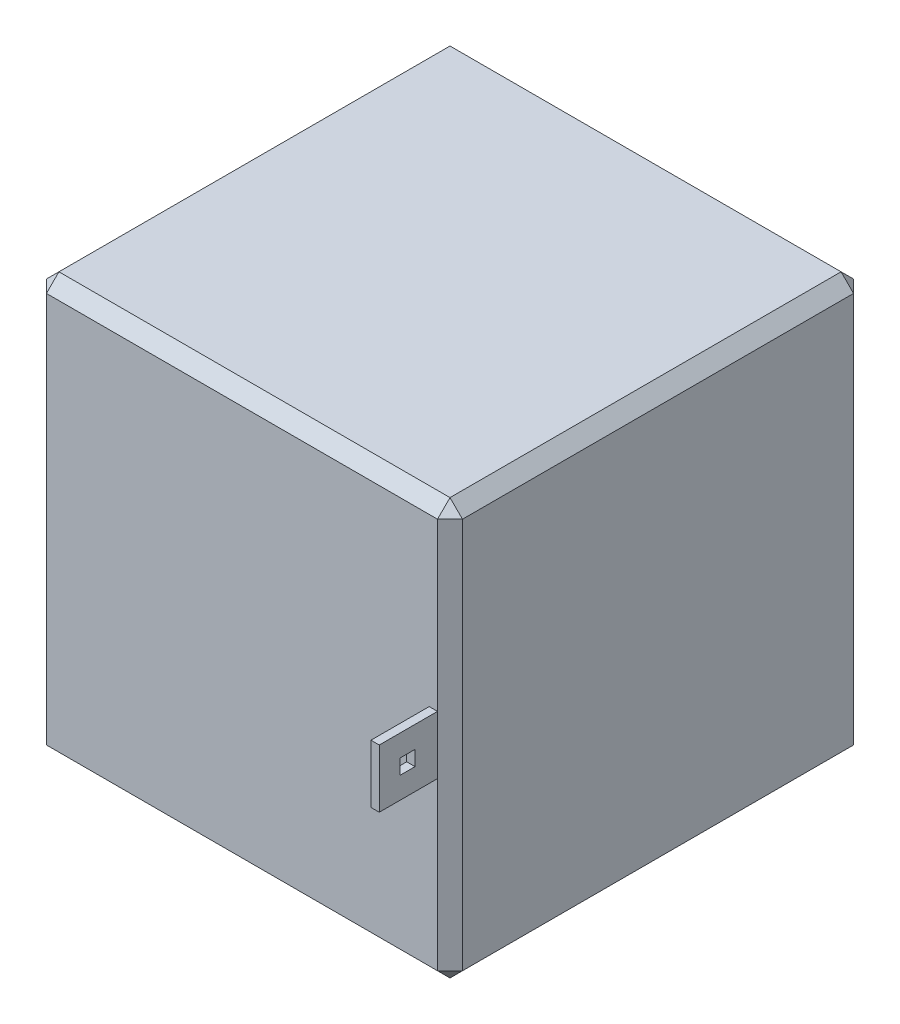
ISO-10303-21;
HEADER;
FILE_DESCRIPTION(('STEP AP214'),'2;1');
FILE_NAME('part.step','',(''),(''),'','','');
FILE_SCHEMA(('AUTOMOTIVE_DESIGN { 1 0 10303 214 1 1 1 1 }'));
ENDSEC;
DATA;
#1=APPLICATION_CONTEXT('core data for automotive mechanical design processes');
#2=APPLICATION_PROTOCOL_DEFINITION('international standard','automotive_design',2000,#1);
#3=PRODUCT_CONTEXT('',#1,'mechanical');
#4=PRODUCT('Part','Part','',(#3));
#5=PRODUCT_RELATED_PRODUCT_CATEGORY('part','',(#4));
#6=PRODUCT_DEFINITION_FORMATION('','',#4);
#7=PRODUCT_DEFINITION_CONTEXT('part definition',#1,'design');
#8=PRODUCT_DEFINITION('design','',#6,#7);
#9=PRODUCT_DEFINITION_SHAPE('','',#8);
#10=(LENGTH_UNIT() NAMED_UNIT(*) SI_UNIT(.MILLI.,.METRE.));
#11=(NAMED_UNIT(*) PLANE_ANGLE_UNIT() SI_UNIT($,.RADIAN.));
#12=(NAMED_UNIT(*) SI_UNIT($,.STERADIAN.) SOLID_ANGLE_UNIT());
#13=UNCERTAINTY_MEASURE_WITH_UNIT(LENGTH_MEASURE(1.E-05),#10,'distance_accuracy_value','');
#14=(GEOMETRIC_REPRESENTATION_CONTEXT(3) GLOBAL_UNCERTAINTY_ASSIGNED_CONTEXT((#13)) GLOBAL_UNIT_ASSIGNED_CONTEXT((#10,
#11,#12)) REPRESENTATION_CONTEXT('',''));
#15=CARTESIAN_POINT('',(0.,0.,0.));
#16=DIRECTION('',(0.,0.,1.));
#17=DIRECTION('',(1.,0.,0.));
#18=AXIS2_PLACEMENT_3D('',#15,#16,#17);
#19=CARTESIAN_POINT('',(0.,0.,50.));
#20=DIRECTION('',(0.,0.,-1.));
#21=DIRECTION('',(-1.,0.,0.));
#22=AXIS2_PLACEMENT_3D('',#19,#20,#21);
#23=PLANE('',#22);
#24=DIRECTION('',(1.,0.,0.));
#25=VECTOR('',#24,1.);
#26=CARTESIAN_POINT('',(48.5,21.5,50.));
#27=LINE('',#26,#25);
#28=CARTESIAN_POINT('',(47.5,21.5,50.));
#29=VERTEX_POINT('',#28);
#30=CARTESIAN_POINT('',(48.5,21.5,50.));
#31=VERTEX_POINT('',#30);
#32=EDGE_CURVE('E210',#29,#31,#27,.T.);
#33=ORIENTED_EDGE('',*,*,#32,.F.);
#34=DIRECTION('',(0.,-1.,0.));
#35=VECTOR('',#34,1.);
#36=CARTESIAN_POINT('',(47.5,21.5,50.));
#37=LINE('',#36,#35);
#38=CARTESIAN_POINT('',(47.5,28.5,50.));
#39=VERTEX_POINT('',#38);
#40=EDGE_CURVE('E217',#39,#29,#37,.T.);
#41=ORIENTED_EDGE('',*,*,#40,.F.);
#42=DIRECTION('',(-1.,0.,0.));
#43=VECTOR('',#42,1.);
#44=CARTESIAN_POINT('',(48.5,28.5,50.));
#45=LINE('',#44,#43);
#46=CARTESIAN_POINT('',(48.5,28.5,50.));
#47=VERTEX_POINT('',#46);
#48=EDGE_CURVE('E220',#47,#39,#45,.T.);
#49=ORIENTED_EDGE('',*,*,#48,.F.);
#50=DIRECTION('',(0.,1.,0.));
#51=VECTOR('',#50,1.);
#52=CARTESIAN_POINT('',(48.5,0.,50.));
#53=LINE('',#52,#51);
#54=CARTESIAN_POINT('',(48.5,48.5,50.));
#55=VERTEX_POINT('',#54);
#56=EDGE_CURVE('E386',#47,#55,#53,.T.);
#57=ORIENTED_EDGE('',*,*,#56,.T.);
#58=DIRECTION('',(-1.,0.,0.));
#59=VECTOR('',#58,1.);
#60=CARTESIAN_POINT('',(0.,48.5,50.));
#61=LINE('',#60,#59);
#62=CARTESIAN_POINT('',(1.50000000000002,48.5,50.));
#63=VERTEX_POINT('',#62);
#64=EDGE_CURVE('E237',#55,#63,#61,.T.);
#65=ORIENTED_EDGE('',*,*,#64,.T.);
#66=DIRECTION('',(0.,-1.,0.));
#67=VECTOR('',#66,1.);
#68=CARTESIAN_POINT('',(1.50000000000002,0.,50.));
#69=LINE('',#68,#67);
#70=CARTESIAN_POINT('',(1.50000000000002,1.50000000000002,50.));
#71=VERTEX_POINT('',#70);
#72=EDGE_CURVE('E526',#63,#71,#69,.T.);
#73=ORIENTED_EDGE('',*,*,#72,.T.);
#74=DIRECTION('',(1.,0.,0.));
#75=VECTOR('',#74,1.);
#76=CARTESIAN_POINT('',(0.,1.50000000000002,50.));
#77=LINE('',#76,#75);
#78=CARTESIAN_POINT('',(48.5,1.50000000000002,50.));
#79=VERTEX_POINT('',#78);
#80=EDGE_CURVE('E453',#71,#79,#77,.T.);
#81=ORIENTED_EDGE('',*,*,#80,.T.);
#82=EDGE_CURVE('E383',#79,#31,#53,.T.);
#83=ORIENTED_EDGE('',*,*,#82,.T.);
#84=EDGE_LOOP('',(#33,#41,#49,#57,#65,#73,#81,#83));
#85=FACE_BOUND('',#84,.T.);
#86=ADVANCED_FACE('F39',(#85),#23,.F.);
#87=CARTESIAN_POINT('',(0.,0.,50.));
#88=DIRECTION('',(1.,0.,0.));
#89=DIRECTION('',(0.,0.,-1.));
#90=AXIS2_PLACEMENT_3D('',#87,#88,#89);
#91=PLANE('',#90);
#92=DIRECTION('',(0.,0.,-1.));
#93=VECTOR('',#92,1.);
#94=CARTESIAN_POINT('',(0.,48.5,50.));
#95=LINE('',#94,#93);
#96=CARTESIAN_POINT('',(0.,48.5,48.5));
#97=VERTEX_POINT('',#96);
#98=CARTESIAN_POINT('',(0.,48.5,1.50000000000002));
#99=VERTEX_POINT('',#98);
#100=EDGE_CURVE('E485',#97,#99,#95,.T.);
#101=ORIENTED_EDGE('',*,*,#100,.T.);
#102=DIRECTION('',(0.,-1.,0.));
#103=VECTOR('',#102,1.);
#104=CARTESIAN_POINT('',(0.,0.,1.50000000000002));
#105=LINE('',#104,#103);
#106=CARTESIAN_POINT('',(0.,1.50000000000002,1.50000000000002));
#107=VERTEX_POINT('',#106);
#108=EDGE_CURVE('E487',#99,#107,#105,.T.);
#109=ORIENTED_EDGE('',*,*,#108,.T.);
#110=DIRECTION('',(0.,0.,1.));
#111=VECTOR('',#110,1.);
#112=CARTESIAN_POINT('',(0.,1.50000000000002,50.));
#113=LINE('',#112,#111);
#114=CARTESIAN_POINT('',(0.,1.50000000000002,48.5));
#115=VERTEX_POINT('',#114);
#116=EDGE_CURVE('E483',#107,#115,#113,.T.);
#117=ORIENTED_EDGE('',*,*,#116,.T.);
#118=DIRECTION('',(0.,1.,0.));
#119=VECTOR('',#118,1.);
#120=CARTESIAN_POINT('',(0.,0.,48.5));
#121=LINE('',#120,#119);
#122=EDGE_CURVE('E449',#115,#97,#121,.T.);
#123=ORIENTED_EDGE('',*,*,#122,.T.);
#124=EDGE_LOOP('',(#101,#109,#117,#123));
#125=FACE_BOUND('',#124,.T.);
#126=ADVANCED_FACE('F259',(#125),#91,.F.);
#127=CARTESIAN_POINT('',(0.,0.,50.));
#128=DIRECTION('',(0.,1.,0.));
#129=DIRECTION('',(0.,0.,1.));
#130=AXIS2_PLACEMENT_3D('',#127,#128,#129);
#131=PLANE('',#130);
#132=DIRECTION('',(-1.,0.,0.));
#133=VECTOR('',#132,1.);
#134=CARTESIAN_POINT('',(0.,0.,48.5));
#135=LINE('',#134,#133);
#136=CARTESIAN_POINT('',(48.5,0.,48.5));
#137=VERTEX_POINT('',#136);
#138=CARTESIAN_POINT('',(1.50000000000002,0.,48.5));
#139=VERTEX_POINT('',#138);
#140=EDGE_CURVE('E517',#137,#139,#135,.T.);
#141=ORIENTED_EDGE('',*,*,#140,.T.);
#142=DIRECTION('',(0.,0.,-1.));
#143=VECTOR('',#142,1.);
#144=CARTESIAN_POINT('',(1.50000000000002,0.,50.));
#145=LINE('',#144,#143);
#146=CARTESIAN_POINT('',(1.50000000000002,0.,1.50000000000002));
#147=VERTEX_POINT('',#146);
#148=EDGE_CURVE('E523',#139,#147,#145,.T.);
#149=ORIENTED_EDGE('',*,*,#148,.T.);
#150=DIRECTION('',(1.,0.,0.));
#151=VECTOR('',#150,1.);
#152=CARTESIAN_POINT('',(50.,0.,1.50000000000002));
#153=LINE('',#152,#151);
#154=CARTESIAN_POINT('',(48.5,0.,1.50000000000002));
#155=VERTEX_POINT('',#154);
#156=EDGE_CURVE('E521',#147,#155,#153,.T.);
#157=ORIENTED_EDGE('',*,*,#156,.T.);
#158=DIRECTION('',(0.,0.,1.));
#159=VECTOR('',#158,1.);
#160=CARTESIAN_POINT('',(48.5,0.,50.));
#161=LINE('',#160,#159);
#162=EDGE_CURVE('E519',#155,#137,#161,.T.);
#163=ORIENTED_EDGE('',*,*,#162,.T.);
#164=EDGE_LOOP('',(#141,#149,#157,#163));
#165=FACE_BOUND('',#164,.T.);
#166=ADVANCED_FACE('F265',(#165),#131,.F.);
#167=CARTESIAN_POINT('',(50.,0.,50.));
#168=DIRECTION('',(-1.,0.,0.));
#169=DIRECTION('',(0.,0.,1.));
#170=AXIS2_PLACEMENT_3D('',#167,#168,#169);
#171=PLANE('',#170);
#172=DIRECTION('',(0.,1.,0.));
#173=VECTOR('',#172,1.);
#174=CARTESIAN_POINT('',(50.,50.,1.50000000000002));
#175=LINE('',#174,#173);
#176=CARTESIAN_POINT('',(50.,1.50000000000002,1.50000000000002));
#177=VERTEX_POINT('',#176);
#178=CARTESIAN_POINT('',(50.,48.5,1.50000000000002));
#179=VERTEX_POINT('',#178);
#180=EDGE_CURVE('E512',#177,#179,#175,.T.);
#181=ORIENTED_EDGE('',*,*,#180,.T.);
#182=DIRECTION('',(0.,0.,1.));
#183=VECTOR('',#182,1.);
#184=CARTESIAN_POINT('',(50.,48.5,50.));
#185=LINE('',#184,#183);
#186=CARTESIAN_POINT('',(50.,48.5,48.5));
#187=VERTEX_POINT('',#186);
#188=EDGE_CURVE('E514',#179,#187,#185,.T.);
#189=ORIENTED_EDGE('',*,*,#188,.T.);
#190=DIRECTION('',(0.,-1.,0.));
#191=VECTOR('',#190,1.);
#192=CARTESIAN_POINT('',(50.,0.,48.5));
#193=LINE('',#192,#191);
#194=CARTESIAN_POINT('',(50.,1.50000000000002,48.5));
#195=VERTEX_POINT('',#194);
#196=EDGE_CURVE('E508',#187,#195,#193,.T.);
#197=ORIENTED_EDGE('',*,*,#196,.T.);
#198=DIRECTION('',(0.,0.,-1.));
#199=VECTOR('',#198,1.);
#200=CARTESIAN_POINT('',(50.,1.50000000000002,50.));
#201=LINE('',#200,#199);
#202=EDGE_CURVE('E510',#195,#177,#201,.T.);
#203=ORIENTED_EDGE('',*,*,#202,.T.);
#204=EDGE_LOOP('',(#181,#189,#197,#203));
#205=FACE_BOUND('',#204,.T.);
#206=ADVANCED_FACE('F278',(#205),#171,.F.);
#207=CARTESIAN_POINT('',(0.,50.,50.));
#208=DIRECTION('',(0.,-1.,0.));
#209=DIRECTION('',(0.,0.,-1.));
#210=AXIS2_PLACEMENT_3D('',#207,#208,#209);
#211=PLANE('',#210);
#212=DIRECTION('',(-1.,0.,0.));
#213=VECTOR('',#212,1.);
#214=CARTESIAN_POINT('',(0.,50.,1.50000000000002));
#215=LINE('',#214,#213);
#216=CARTESIAN_POINT('',(48.5,50.,1.50000000000002));
#217=VERTEX_POINT('',#216);
#218=CARTESIAN_POINT('',(1.50000000000002,50.,1.50000000000002));
#219=VERTEX_POINT('',#218);
#220=EDGE_CURVE('E503',#217,#219,#215,.T.);
#221=ORIENTED_EDGE('',*,*,#220,.T.);
#222=DIRECTION('',(0.,0.,1.));
#223=VECTOR('',#222,1.);
#224=CARTESIAN_POINT('',(1.50000000000002,50.,50.));
#225=LINE('',#224,#223);
#226=CARTESIAN_POINT('',(1.50000000000002,50.,48.5));
#227=VERTEX_POINT('',#226);
#228=EDGE_CURVE('E505',#219,#227,#225,.T.);
#229=ORIENTED_EDGE('',*,*,#228,.T.);
#230=DIRECTION('',(1.,0.,0.));
#231=VECTOR('',#230,1.);
#232=CARTESIAN_POINT('',(0.,50.,48.5));
#233=LINE('',#232,#231);
#234=CARTESIAN_POINT('',(48.5,50.,48.5));
#235=VERTEX_POINT('',#234);
#236=EDGE_CURVE('E499',#227,#235,#233,.T.);
#237=ORIENTED_EDGE('',*,*,#236,.T.);
#238=DIRECTION('',(0.,0.,-1.));
#239=VECTOR('',#238,1.);
#240=CARTESIAN_POINT('',(48.5,50.,50.));
#241=LINE('',#240,#239);
#242=EDGE_CURVE('E501',#235,#217,#241,.T.);
#243=ORIENTED_EDGE('',*,*,#242,.T.);
#244=EDGE_LOOP('',(#221,#229,#237,#243));
#245=FACE_BOUND('',#244,.T.);
#246=ADVANCED_FACE('F274',(#245),#211,.F.);
#247=CARTESIAN_POINT('',(0.,0.,0.));
#248=DIRECTION('',(0.,0.,-1.));
#249=DIRECTION('',(-1.,0.,0.));
#250=AXIS2_PLACEMENT_3D('',#247,#248,#249);
#251=PLANE('',#250);
#252=DIRECTION('',(-1.,0.,0.));
#253=VECTOR('',#252,1.);
#254=CARTESIAN_POINT('',(0.,1.50000000000002,0.));
#255=LINE('',#254,#253);
#256=CARTESIAN_POINT('',(48.5,1.50000000000002,0.));
#257=VERTEX_POINT('',#256);
#258=CARTESIAN_POINT('',(1.50000000000002,1.50000000000002,0.));
#259=VERTEX_POINT('',#258);
#260=EDGE_CURVE('E490',#257,#259,#255,.T.);
#261=ORIENTED_EDGE('',*,*,#260,.T.);
#262=DIRECTION('',(0.,1.,0.));
#263=VECTOR('',#262,1.);
#264=CARTESIAN_POINT('',(1.50000000000002,50.,0.));
#265=LINE('',#264,#263);
#266=CARTESIAN_POINT('',(1.50000000000002,48.5,0.));
#267=VERTEX_POINT('',#266);
#268=EDGE_CURVE('E496',#259,#267,#265,.T.);
#269=ORIENTED_EDGE('',*,*,#268,.T.);
#270=DIRECTION('',(1.,0.,0.));
#271=VECTOR('',#270,1.);
#272=CARTESIAN_POINT('',(50.,48.5,0.));
#273=LINE('',#272,#271);
#274=CARTESIAN_POINT('',(48.5,48.5,0.));
#275=VERTEX_POINT('',#274);
#276=EDGE_CURVE('E494',#267,#275,#273,.T.);
#277=ORIENTED_EDGE('',*,*,#276,.T.);
#278=DIRECTION('',(0.,-1.,0.));
#279=VECTOR('',#278,1.);
#280=CARTESIAN_POINT('',(48.5,0.,0.));
#281=LINE('',#280,#279);
#282=EDGE_CURVE('E492',#275,#257,#281,.T.);
#283=ORIENTED_EDGE('',*,*,#282,.T.);
#284=EDGE_LOOP('',(#261,#269,#277,#283));
#285=FACE_BOUND('',#284,.T.);
#286=ADVANCED_FACE('F271',(#285),#251,.T.);
#287=CARTESIAN_POINT('',(48.5,0.,50.));
#288=DIRECTION('',(-0.707106781186547,0.,-0.707106781186547));
#289=DIRECTION('',(0.,1.,0.));
#290=AXIS2_PLACEMENT_3D('',#287,#288,#289);
#291=PLANE('',#290);
#292=DIRECTION('',(-0.707106781186547,0.,0.707106781186547));
#293=VECTOR('',#292,1.);
#294=CARTESIAN_POINT('',(50.,48.5,48.5));
#295=LINE('',#294,#293);
#296=EDGE_CURVE('E371',#55,#187,#295,.F.);
#297=ORIENTED_EDGE('',*,*,#296,.F.);
#298=ORIENTED_EDGE('',*,*,#56,.F.);
#299=DIRECTION('',(0.,1.,0.));
#300=VECTOR('',#299,1.);
#301=CARTESIAN_POINT('',(48.5,21.5,50.));
#302=LINE('',#301,#300);
#303=EDGE_CURVE('E203',#31,#47,#302,.T.);
#304=ORIENTED_EDGE('',*,*,#303,.F.);
#305=ORIENTED_EDGE('',*,*,#82,.F.);
#306=DIRECTION('',(0.707106781186547,0.,-0.707106781186547));
#307=VECTOR('',#306,1.);
#308=CARTESIAN_POINT('',(49.25,1.50000000000002,49.25));
#309=LINE('',#308,#307);
#310=EDGE_CURVE('E446',#195,#79,#309,.F.);
#311=ORIENTED_EDGE('',*,*,#310,.F.);
#312=ORIENTED_EDGE('',*,*,#196,.F.);
#313=EDGE_LOOP('',(#297,#298,#304,#305,#311,#312));
#314=FACE_BOUND('',#313,.T.);
#315=ADVANCED_FACE('F41',(#314),#291,.F.);
#316=CARTESIAN_POINT('',(50.,48.5,48.5));
#317=DIRECTION('',(0.577350269189626,0.577350269189626,0.577350269189626));
#318=DIRECTION('',(0.707106781186547,0.,-0.707106781186547));
#319=AXIS2_PLACEMENT_3D('',#316,#317,#318);
#320=PLANE('',#319);
#321=DIRECTION('',(0.,0.707106781186547,-0.707106781186547));
#322=VECTOR('',#321,1.);
#323=CARTESIAN_POINT('',(48.5,49.25,49.25));
#324=LINE('',#323,#322);
#325=EDGE_CURVE('E368',#55,#235,#324,.T.);
#326=ORIENTED_EDGE('',*,*,#325,.F.);
#327=ORIENTED_EDGE('',*,*,#296,.T.);
#328=DIRECTION('',(0.707106781186547,-0.707106781186547,0.));
#329=VECTOR('',#328,1.);
#330=CARTESIAN_POINT('',(50.,48.5,48.5));
#331=LINE('',#330,#329);
#332=EDGE_CURVE('E373',#235,#187,#331,.T.);
#333=ORIENTED_EDGE('',*,*,#332,.F.);
#334=EDGE_LOOP('',(#326,#327,#333));
#335=FACE_BOUND('',#334,.T.);
#336=ADVANCED_FACE('F356',(#335),#320,.T.);
#337=CARTESIAN_POINT('',(48.5,0.,48.5));
#338=DIRECTION('',(0.577350269189626,-0.577350269189626,0.577350269189626));
#339=DIRECTION('',(0.707106781186547,0.,-0.707106781186547));
#340=AXIS2_PLACEMENT_3D('',#337,#338,#339);
#341=PLANE('',#340);
#342=DIRECTION('',(-0.707106781186547,-0.707106781186547,0.));
#343=VECTOR('',#342,1.);
#344=CARTESIAN_POINT('',(48.5,0.,48.5));
#345=LINE('',#344,#343);
#346=EDGE_CURVE('E440',#195,#137,#345,.T.);
#347=ORIENTED_EDGE('',*,*,#346,.F.);
#348=ORIENTED_EDGE('',*,*,#310,.T.);
#349=DIRECTION('',(0.,0.707106781186547,0.707106781186547));
#350=VECTOR('',#349,1.);
#351=CARTESIAN_POINT('',(48.5,0.,48.5));
#352=LINE('',#351,#350);
#353=EDGE_CURVE('E376',#137,#79,#352,.T.);
#354=ORIENTED_EDGE('',*,*,#353,.F.);
#355=EDGE_LOOP('',(#347,#348,#354));
#356=FACE_BOUND('',#355,.T.);
#357=ADVANCED_FACE('F353',(#356),#341,.T.);
#358=CARTESIAN_POINT('',(48.5,50.,50.));
#359=DIRECTION('',(-0.707106781186547,-0.707106781186547,0.));
#360=DIRECTION('',(0.,0.,-1.));
#361=AXIS2_PLACEMENT_3D('',#358,#359,#360);
#362=PLANE('',#361);
#363=ORIENTED_EDGE('',*,*,#332,.T.);
#364=ORIENTED_EDGE('',*,*,#188,.F.);
#365=DIRECTION('',(-0.707106781186547,0.707106781186547,0.));
#366=VECTOR('',#365,1.);
#367=CARTESIAN_POINT('',(49.25,49.25,1.50000000000002));
#368=LINE('',#367,#366);
#369=EDGE_CURVE('E434',#217,#179,#368,.F.);
#370=ORIENTED_EDGE('',*,*,#369,.F.);
#371=ORIENTED_EDGE('',*,*,#242,.F.);
#372=EDGE_LOOP('',(#363,#364,#370,#371));
#373=FACE_BOUND('',#372,.T.);
#374=ADVANCED_FACE('F349',(#373),#362,.F.);
#375=CARTESIAN_POINT('',(0.,48.5,50.));
#376=DIRECTION('',(0.,-0.707106781186547,-0.707106781186547));
#377=DIRECTION('',(-1.,0.,0.));
#378=AXIS2_PLACEMENT_3D('',#375,#376,#377);
#379=PLANE('',#378);
#380=ORIENTED_EDGE('',*,*,#325,.T.);
#381=ORIENTED_EDGE('',*,*,#236,.F.);
#382=DIRECTION('',(0.,-0.707106781186547,0.707106781186547));
#383=VECTOR('',#382,1.);
#384=CARTESIAN_POINT('',(1.50000000000002,50.,48.5));
#385=LINE('',#384,#383);
#386=EDGE_CURVE('E381',#63,#227,#385,.F.);
#387=ORIENTED_EDGE('',*,*,#386,.F.);
#388=ORIENTED_EDGE('',*,*,#64,.F.);
#389=EDGE_LOOP('',(#380,#381,#387,#388));
#390=FACE_BOUND('',#389,.T.);
#391=ADVANCED_FACE('F345',(#390),#379,.F.);
#392=CARTESIAN_POINT('',(1.50000000000002,0.,50.));
#393=DIRECTION('',(0.707106781186547,0.,-0.707106781186547));
#394=DIRECTION('',(0.,-1.,0.));
#395=AXIS2_PLACEMENT_3D('',#392,#393,#394);
#396=PLANE('',#395);
#397=DIRECTION('',(0.707106781186547,0.,0.707106781186547));
#398=VECTOR('',#397,1.);
#399=CARTESIAN_POINT('',(0.,1.50000000000002,48.5));
#400=LINE('',#399,#398);
#401=EDGE_CURVE('E428',#71,#115,#400,.F.);
#402=ORIENTED_EDGE('',*,*,#401,.F.);
#403=ORIENTED_EDGE('',*,*,#72,.F.);
#404=DIRECTION('',(-0.707106781186547,0.,-0.707106781186547));
#405=VECTOR('',#404,1.);
#406=CARTESIAN_POINT('',(0.750000000000008,48.5,49.25));
#407=LINE('',#406,#405);
#408=EDGE_CURVE('E431',#97,#63,#407,.F.);
#409=ORIENTED_EDGE('',*,*,#408,.F.);
#410=ORIENTED_EDGE('',*,*,#122,.F.);
#411=EDGE_LOOP('',(#402,#403,#409,#410));
#412=FACE_BOUND('',#411,.T.);
#413=ADVANCED_FACE('F341',(#412),#396,.F.);
#414=CARTESIAN_POINT('',(0.,1.50000000000002,50.));
#415=DIRECTION('',(0.,0.707106781186547,-0.707106781186547));
#416=DIRECTION('',(1.,0.,0.));
#417=AXIS2_PLACEMENT_3D('',#414,#415,#416);
#418=PLANE('',#417);
#419=ORIENTED_EDGE('',*,*,#353,.T.);
#420=ORIENTED_EDGE('',*,*,#80,.F.);
#421=DIRECTION('',(0.,-0.707106781186547,-0.707106781186547));
#422=VECTOR('',#421,1.);
#423=CARTESIAN_POINT('',(1.50000000000002,0.750000000000008,49.25));
#424=LINE('',#423,#422);
#425=EDGE_CURVE('E425',#139,#71,#424,.F.);
#426=ORIENTED_EDGE('',*,*,#425,.F.);
#427=ORIENTED_EDGE('',*,*,#140,.F.);
#428=EDGE_LOOP('',(#419,#420,#426,#427));
#429=FACE_BOUND('',#428,.T.);
#430=ADVANCED_FACE('F337',(#429),#418,.F.);
#431=CARTESIAN_POINT('',(50.,1.50000000000002,50.));
#432=DIRECTION('',(-0.707106781186547,0.707106781186547,0.));
#433=DIRECTION('',(0.,0.,-1.));
#434=AXIS2_PLACEMENT_3D('',#431,#432,#433);
#435=PLANE('',#434);
#436=ORIENTED_EDGE('',*,*,#346,.T.);
#437=ORIENTED_EDGE('',*,*,#162,.F.);
#438=DIRECTION('',(0.707106781186547,0.707106781186547,0.));
#439=VECTOR('',#438,1.);
#440=CARTESIAN_POINT('',(49.25,0.750000000000008,1.50000000000002));
#441=LINE('',#440,#439);
#442=EDGE_CURVE('E422',#177,#155,#441,.F.);
#443=ORIENTED_EDGE('',*,*,#442,.F.);
#444=ORIENTED_EDGE('',*,*,#202,.F.);
#445=EDGE_LOOP('',(#436,#437,#443,#444));
#446=FACE_BOUND('',#445,.T.);
#447=ADVANCED_FACE('F333',(#446),#435,.F.);
#448=CARTESIAN_POINT('',(50.,0.,1.50000000000002));
#449=DIRECTION('',(0.707106781186547,0.,-0.707106781186547));
#450=DIRECTION('',(0.,-1.,0.));
#451=AXIS2_PLACEMENT_3D('',#448,#449,#450);
#452=PLANE('',#451);
#453=DIRECTION('',(-0.707106781186547,0.,-0.707106781186547));
#454=VECTOR('',#453,1.);
#455=CARTESIAN_POINT('',(48.5,48.5,0.));
#456=LINE('',#455,#454);
#457=EDGE_CURVE('E437',#179,#275,#456,.T.);
#458=ORIENTED_EDGE('',*,*,#457,.F.);
#459=ORIENTED_EDGE('',*,*,#180,.F.);
#460=DIRECTION('',(0.707106781186547,0.,0.707106781186547));
#461=VECTOR('',#460,1.);
#462=CARTESIAN_POINT('',(48.5,1.50000000000002,0.));
#463=LINE('',#462,#461);
#464=EDGE_CURVE('E419',#257,#177,#463,.T.);
#465=ORIENTED_EDGE('',*,*,#464,.F.);
#466=ORIENTED_EDGE('',*,*,#282,.F.);
#467=EDGE_LOOP('',(#458,#459,#465,#466));
#468=FACE_BOUND('',#467,.T.);
#469=ADVANCED_FACE('F329',(#468),#452,.T.);
#470=CARTESIAN_POINT('',(48.5,48.5,0.));
#471=DIRECTION('',(0.577350269189626,0.577350269189626,-0.577350269189626));
#472=DIRECTION('',(-0.707106781186547,0.,-0.707106781186547));
#473=AXIS2_PLACEMENT_3D('',#470,#471,#472);
#474=PLANE('',#473);
#475=ORIENTED_EDGE('',*,*,#369,.T.);
#476=ORIENTED_EDGE('',*,*,#457,.T.);
#477=DIRECTION('',(0.,0.707106781186547,0.707106781186547));
#478=VECTOR('',#477,1.);
#479=CARTESIAN_POINT('',(48.5,48.5,0.));
#480=LINE('',#479,#478);
#481=EDGE_CURVE('E416',#217,#275,#480,.F.);
#482=ORIENTED_EDGE('',*,*,#481,.F.);
#483=EDGE_LOOP('',(#475,#476,#482));
#484=FACE_BOUND('',#483,.T.);
#485=ADVANCED_FACE('F325',(#484),#474,.T.);
#486=CARTESIAN_POINT('',(1.50000000000002,50.,48.5));
#487=DIRECTION('',(-0.577350269189626,0.577350269189626,0.577350269189626));
#488=DIRECTION('',(0.707106781186547,0.,0.707106781186547));
#489=AXIS2_PLACEMENT_3D('',#486,#487,#488);
#490=PLANE('',#489);
#491=ORIENTED_EDGE('',*,*,#408,.T.);
#492=ORIENTED_EDGE('',*,*,#386,.T.);
#493=DIRECTION('',(0.707106781186547,0.707106781186547,0.));
#494=VECTOR('',#493,1.);
#495=CARTESIAN_POINT('',(1.50000000000002,50.,48.5));
#496=LINE('',#495,#494);
#497=EDGE_CURVE('E414',#97,#227,#496,.T.);
#498=ORIENTED_EDGE('',*,*,#497,.F.);
#499=EDGE_LOOP('',(#491,#492,#498));
#500=FACE_BOUND('',#499,.T.);
#501=ADVANCED_FACE('F321',(#500),#490,.T.);
#502=CARTESIAN_POINT('',(0.,1.50000000000002,48.5));
#503=DIRECTION('',(-0.577350269189626,-0.577350269189626,0.577350269189626));
#504=DIRECTION('',(0.707106781186547,0.,0.707106781186547));
#505=AXIS2_PLACEMENT_3D('',#502,#503,#504);
#506=PLANE('',#505);
#507=ORIENTED_EDGE('',*,*,#425,.T.);
#508=ORIENTED_EDGE('',*,*,#401,.T.);
#509=DIRECTION('',(-0.707106781186547,0.707106781186547,0.));
#510=VECTOR('',#509,1.);
#511=CARTESIAN_POINT('',(0.,1.50000000000002,48.5));
#512=LINE('',#511,#510);
#513=EDGE_CURVE('E411',#139,#115,#512,.T.);
#514=ORIENTED_EDGE('',*,*,#513,.F.);
#515=EDGE_LOOP('',(#507,#508,#514));
#516=FACE_BOUND('',#515,.T.);
#517=ADVANCED_FACE('F317',(#516),#506,.T.);
#518=CARTESIAN_POINT('',(48.5,1.50000000000002,0.));
#519=DIRECTION('',(0.577350269189626,-0.577350269189626,-0.577350269189626));
#520=DIRECTION('',(-0.707106781186547,0.,-0.707106781186547));
#521=AXIS2_PLACEMENT_3D('',#518,#519,#520);
#522=PLANE('',#521);
#523=ORIENTED_EDGE('',*,*,#464,.T.);
#524=ORIENTED_EDGE('',*,*,#442,.T.);
#525=DIRECTION('',(0.,0.707106781186547,-0.707106781186547));
#526=VECTOR('',#525,1.);
#527=CARTESIAN_POINT('',(48.5,1.50000000000002,0.));
#528=LINE('',#527,#526);
#529=EDGE_CURVE('E408',#257,#155,#528,.F.);
#530=ORIENTED_EDGE('',*,*,#529,.F.);
#531=EDGE_LOOP('',(#523,#524,#530));
#532=FACE_BOUND('',#531,.T.);
#533=ADVANCED_FACE('F313',(#532),#522,.T.);
#534=CARTESIAN_POINT('',(0.,50.,1.50000000000002));
#535=DIRECTION('',(0.,0.707106781186547,-0.707106781186547));
#536=DIRECTION('',(1.,0.,0.));
#537=AXIS2_PLACEMENT_3D('',#534,#535,#536);
#538=PLANE('',#537);
#539=ORIENTED_EDGE('',*,*,#481,.T.);
#540=ORIENTED_EDGE('',*,*,#276,.F.);
#541=DIRECTION('',(0.,-0.707106781186547,-0.707106781186547));
#542=VECTOR('',#541,1.);
#543=CARTESIAN_POINT('',(1.50000000000002,48.5,0.));
#544=LINE('',#543,#542);
#545=EDGE_CURVE('E405',#219,#267,#544,.T.);
#546=ORIENTED_EDGE('',*,*,#545,.F.);
#547=ORIENTED_EDGE('',*,*,#220,.F.);
#548=EDGE_LOOP('',(#539,#540,#546,#547));
#549=FACE_BOUND('',#548,.T.);
#550=ADVANCED_FACE('F309',(#549),#538,.T.);
#551=CARTESIAN_POINT('',(0.,48.5,50.));
#552=DIRECTION('',(0.707106781186547,-0.707106781186547,0.));
#553=DIRECTION('',(0.,0.,-1.));
#554=AXIS2_PLACEMENT_3D('',#551,#552,#553);
#555=PLANE('',#554);
#556=ORIENTED_EDGE('',*,*,#497,.T.);
#557=ORIENTED_EDGE('',*,*,#228,.F.);
#558=DIRECTION('',(-0.707106781186547,-0.707106781186547,0.));
#559=VECTOR('',#558,1.);
#560=CARTESIAN_POINT('',(0.750000000000008,49.25,1.50000000000002));
#561=LINE('',#560,#559);
#562=EDGE_CURVE('E402',#99,#219,#561,.F.);
#563=ORIENTED_EDGE('',*,*,#562,.F.);
#564=ORIENTED_EDGE('',*,*,#100,.F.);
#565=EDGE_LOOP('',(#556,#557,#563,#564));
#566=FACE_BOUND('',#565,.T.);
#567=ADVANCED_FACE('F305',(#566),#555,.F.);
#568=CARTESIAN_POINT('',(1.50000000000002,0.,50.));
#569=DIRECTION('',(0.707106781186547,0.707106781186547,0.));
#570=DIRECTION('',(0.,0.,-1.));
#571=AXIS2_PLACEMENT_3D('',#568,#569,#570);
#572=PLANE('',#571);
#573=ORIENTED_EDGE('',*,*,#513,.T.);
#574=ORIENTED_EDGE('',*,*,#116,.F.);
#575=DIRECTION('',(0.707106781186547,-0.707106781186547,0.));
#576=VECTOR('',#575,1.);
#577=CARTESIAN_POINT('',(0.,1.50000000000002,1.50000000000002));
#578=LINE('',#577,#576);
#579=EDGE_CURVE('E399',#147,#107,#578,.F.);
#580=ORIENTED_EDGE('',*,*,#579,.F.);
#581=ORIENTED_EDGE('',*,*,#148,.F.);
#582=EDGE_LOOP('',(#573,#574,#580,#581));
#583=FACE_BOUND('',#582,.T.);
#584=ADVANCED_FACE('F301',(#583),#572,.F.);
#585=CARTESIAN_POINT('',(0.,0.,1.50000000000002));
#586=DIRECTION('',(0.,-0.707106781186547,-0.707106781186547));
#587=DIRECTION('',(-1.,0.,0.));
#588=AXIS2_PLACEMENT_3D('',#585,#586,#587);
#589=PLANE('',#588);
#590=ORIENTED_EDGE('',*,*,#529,.T.);
#591=ORIENTED_EDGE('',*,*,#156,.F.);
#592=DIRECTION('',(0.,-0.707106781186547,0.707106781186547));
#593=VECTOR('',#592,1.);
#594=CARTESIAN_POINT('',(1.50000000000002,0.750000000000008,0.750000000000008));
#595=LINE('',#594,#593);
#596=EDGE_CURVE('E397',#259,#147,#595,.T.);
#597=ORIENTED_EDGE('',*,*,#596,.F.);
#598=ORIENTED_EDGE('',*,*,#260,.F.);
#599=EDGE_LOOP('',(#590,#591,#597,#598));
#600=FACE_BOUND('',#599,.T.);
#601=ADVANCED_FACE('F297',(#600),#589,.T.);
#602=CARTESIAN_POINT('',(1.50000000000002,48.5,0.));
#603=DIRECTION('',(-0.577350269189626,0.577350269189626,-0.577350269189626));
#604=DIRECTION('',(-0.707106781186547,0.,0.707106781186547));
#605=AXIS2_PLACEMENT_3D('',#602,#603,#604);
#606=PLANE('',#605);
#607=ORIENTED_EDGE('',*,*,#562,.T.);
#608=ORIENTED_EDGE('',*,*,#545,.T.);
#609=DIRECTION('',(-0.707106781186547,0.,0.707106781186547));
#610=VECTOR('',#609,1.);
#611=CARTESIAN_POINT('',(1.50000000000002,48.5,0.));
#612=LINE('',#611,#610);
#613=EDGE_CURVE('E394',#99,#267,#612,.F.);
#614=ORIENTED_EDGE('',*,*,#613,.F.);
#615=EDGE_LOOP('',(#607,#608,#614));
#616=FACE_BOUND('',#615,.T.);
#617=ADVANCED_FACE('F293',(#616),#606,.T.);
#618=CARTESIAN_POINT('',(0.,1.50000000000002,1.50000000000002));
#619=DIRECTION('',(-0.577350269189626,-0.577350269189626,-0.577350269189626));
#620=DIRECTION('',(-0.707106781186547,0.,0.707106781186547));
#621=AXIS2_PLACEMENT_3D('',#618,#619,#620);
#622=PLANE('',#621);
#623=ORIENTED_EDGE('',*,*,#596,.T.);
#624=ORIENTED_EDGE('',*,*,#579,.T.);
#625=DIRECTION('',(0.707106781186547,0.,-0.707106781186547));
#626=VECTOR('',#625,1.);
#627=CARTESIAN_POINT('',(0.,1.50000000000002,1.50000000000002));
#628=LINE('',#627,#626);
#629=EDGE_CURVE('E392',#259,#107,#628,.F.);
#630=ORIENTED_EDGE('',*,*,#629,.F.);
#631=EDGE_LOOP('',(#623,#624,#630));
#632=FACE_BOUND('',#631,.T.);
#633=ADVANCED_FACE('F289',(#632),#622,.T.);
#634=CARTESIAN_POINT('',(0.,0.,1.50000000000002));
#635=DIRECTION('',(-0.707106781186547,0.,-0.707106781186547));
#636=DIRECTION('',(0.,1.,0.));
#637=AXIS2_PLACEMENT_3D('',#634,#635,#636);
#638=PLANE('',#637);
#639=ORIENTED_EDGE('',*,*,#613,.T.);
#640=ORIENTED_EDGE('',*,*,#268,.F.);
#641=ORIENTED_EDGE('',*,*,#629,.T.);
#642=ORIENTED_EDGE('',*,*,#108,.F.);
#643=EDGE_LOOP('',(#639,#640,#641,#642));
#644=FACE_BOUND('',#643,.T.);
#645=ADVANCED_FACE('F286',(#644),#638,.T.);
#646=CARTESIAN_POINT('',(48.5,21.5,57.));
#647=DIRECTION('',(-1.,0.,0.));
#648=DIRECTION('',(0.,0.,1.));
#649=AXIS2_PLACEMENT_3D('',#646,#647,#648);
#650=PLANE('',#649);
#651=DIRECTION('',(0.,0.,-1.));
#652=VECTOR('',#651,1.);
#653=CARTESIAN_POINT('',(48.5,24.1,52.7));
#654=LINE('',#653,#652);
#655=CARTESIAN_POINT('',(48.5,24.1,54.5));
#656=VERTEX_POINT('',#655);
#657=CARTESIAN_POINT('',(48.5,24.1,52.7));
#658=VERTEX_POINT('',#657);
#659=EDGE_CURVE('E189',#656,#658,#654,.T.);
#660=ORIENTED_EDGE('',*,*,#659,.F.);
#661=DIRECTION('',(0.,-1.,0.));
#662=VECTOR('',#661,1.);
#663=CARTESIAN_POINT('',(48.5,24.1,54.5));
#664=LINE('',#663,#662);
#665=CARTESIAN_POINT('',(48.5,25.9,54.5));
#666=VERTEX_POINT('',#665);
#667=EDGE_CURVE('E54',#666,#656,#664,.T.);
#668=ORIENTED_EDGE('',*,*,#667,.F.);
#669=DIRECTION('',(0.,0.,1.));
#670=VECTOR('',#669,1.);
#671=CARTESIAN_POINT('',(48.5,25.9,52.7));
#672=LINE('',#671,#670);
#673=CARTESIAN_POINT('',(48.5,25.9,52.7));
#674=VERTEX_POINT('',#673);
#675=EDGE_CURVE('E196',#674,#666,#672,.T.);
#676=ORIENTED_EDGE('',*,*,#675,.F.);
#677=DIRECTION('',(0.,1.,0.));
#678=VECTOR('',#677,1.);
#679=CARTESIAN_POINT('',(48.5,24.1,52.7));
#680=LINE('',#679,#678);
#681=EDGE_CURVE('E180',#658,#674,#680,.T.);
#682=ORIENTED_EDGE('',*,*,#681,.F.);
#683=EDGE_LOOP('',(#660,#668,#676,#682));
#684=FACE_BOUND('',#683,.T.);
#685=ORIENTED_EDGE('',*,*,#303,.T.);
#686=DIRECTION('',(0.,0.,-1.));
#687=VECTOR('',#686,1.);
#688=CARTESIAN_POINT('',(48.5,28.5,57.));
#689=LINE('',#688,#687);
#690=CARTESIAN_POINT('',(48.5,28.5,57.));
#691=VERTEX_POINT('',#690);
#692=EDGE_CURVE('E395',#691,#47,#689,.T.);
#693=ORIENTED_EDGE('',*,*,#692,.F.);
#694=DIRECTION('',(0.,1.,0.));
#695=VECTOR('',#694,1.);
#696=CARTESIAN_POINT('',(48.5,21.5,57.));
#697=LINE('',#696,#695);
#698=CARTESIAN_POINT('',(48.5,21.5,57.));
#699=VERTEX_POINT('',#698);
#700=EDGE_CURVE('E206',#699,#691,#697,.T.);
#701=ORIENTED_EDGE('',*,*,#700,.F.);
#702=DIRECTION('',(0.,0.,-1.));
#703=VECTOR('',#702,1.);
#704=CARTESIAN_POINT('',(48.5,21.5,57.));
#705=LINE('',#704,#703);
#706=EDGE_CURVE('E216',#699,#31,#705,.T.);
#707=ORIENTED_EDGE('',*,*,#706,.T.);
#708=EDGE_LOOP('',(#685,#693,#701,#707));
#709=FACE_BOUND('',#708,.T.);
#710=ADVANCED_FACE('F193',(#684,#709),#650,.F.);
#711=CARTESIAN_POINT('',(48.5,28.5,57.));
#712=DIRECTION('',(0.,-1.,0.));
#713=DIRECTION('',(0.,0.,-1.));
#714=AXIS2_PLACEMENT_3D('',#711,#712,#713);
#715=PLANE('',#714);
#716=ORIENTED_EDGE('',*,*,#48,.T.);
#717=DIRECTION('',(0.,0.,-1.));
#718=VECTOR('',#717,1.);
#719=CARTESIAN_POINT('',(47.5,28.5,57.));
#720=LINE('',#719,#718);
#721=CARTESIAN_POINT('',(47.5,28.5,57.));
#722=VERTEX_POINT('',#721);
#723=EDGE_CURVE('E462',#722,#39,#720,.T.);
#724=ORIENTED_EDGE('',*,*,#723,.F.);
#725=DIRECTION('',(-1.,0.,0.));
#726=VECTOR('',#725,1.);
#727=CARTESIAN_POINT('',(48.5,28.5,57.));
#728=LINE('',#727,#726);
#729=EDGE_CURVE('E209',#691,#722,#728,.T.);
#730=ORIENTED_EDGE('',*,*,#729,.F.);
#731=ORIENTED_EDGE('',*,*,#692,.T.);
#732=EDGE_LOOP('',(#716,#724,#730,#731));
#733=FACE_BOUND('',#732,.T.);
#734=ADVANCED_FACE('F564',(#733),#715,.F.);
#735=CARTESIAN_POINT('',(47.5,21.5,57.));
#736=DIRECTION('',(1.,0.,0.));
#737=DIRECTION('',(0.,0.,-1.));
#738=AXIS2_PLACEMENT_3D('',#735,#736,#737);
#739=PLANE('',#738);
#740=DIRECTION('',(0.,0.,1.));
#741=VECTOR('',#740,1.);
#742=CARTESIAN_POINT('',(47.5,25.9,57.));
#743=LINE('',#742,#741);
#744=CARTESIAN_POINT('',(47.5,25.9,52.7));
#745=VERTEX_POINT('',#744);
#746=CARTESIAN_POINT('',(47.5,25.9,54.5));
#747=VERTEX_POINT('',#746);
#748=EDGE_CURVE('E47',#745,#747,#743,.T.);
#749=ORIENTED_EDGE('',*,*,#748,.T.);
#750=DIRECTION('',(0.,-1.,0.));
#751=VECTOR('',#750,1.);
#752=CARTESIAN_POINT('',(47.5,21.5,54.5));
#753=LINE('',#752,#751);
#754=CARTESIAN_POINT('',(47.5,24.1,54.5));
#755=VERTEX_POINT('',#754);
#756=EDGE_CURVE('E11',#747,#755,#753,.T.);
#757=ORIENTED_EDGE('',*,*,#756,.T.);
#758=DIRECTION('',(0.,0.,-1.));
#759=VECTOR('',#758,1.);
#760=CARTESIAN_POINT('',(47.5,24.1,57.));
#761=LINE('',#760,#759);
#762=CARTESIAN_POINT('',(47.5,24.1,52.7));
#763=VERTEX_POINT('',#762);
#764=EDGE_CURVE('E235',#755,#763,#761,.T.);
#765=ORIENTED_EDGE('',*,*,#764,.T.);
#766=DIRECTION('',(0.,1.,0.));
#767=VECTOR('',#766,1.);
#768=CARTESIAN_POINT('',(47.5,21.5,52.7));
#769=LINE('',#768,#767);
#770=EDGE_CURVE('E183',#763,#745,#769,.T.);
#771=ORIENTED_EDGE('',*,*,#770,.T.);
#772=EDGE_LOOP('',(#749,#757,#765,#771));
#773=FACE_BOUND('',#772,.T.);
#774=ORIENTED_EDGE('',*,*,#40,.T.);
#775=DIRECTION('',(0.,0.,-1.));
#776=VECTOR('',#775,1.);
#777=CARTESIAN_POINT('',(47.5,21.5,57.));
#778=LINE('',#777,#776);
#779=CARTESIAN_POINT('',(47.5,21.5,57.));
#780=VERTEX_POINT('',#779);
#781=EDGE_CURVE('E223',#780,#29,#778,.T.);
#782=ORIENTED_EDGE('',*,*,#781,.F.);
#783=DIRECTION('',(0.,-1.,0.));
#784=VECTOR('',#783,1.);
#785=CARTESIAN_POINT('',(47.5,21.5,57.));
#786=LINE('',#785,#784);
#787=EDGE_CURVE('E212',#722,#780,#786,.T.);
#788=ORIENTED_EDGE('',*,*,#787,.F.);
#789=ORIENTED_EDGE('',*,*,#723,.T.);
#790=EDGE_LOOP('',(#774,#782,#788,#789));
#791=FACE_BOUND('',#790,.T.);
#792=ADVANCED_FACE('F240',(#773,#791),#739,.F.);
#793=CARTESIAN_POINT('',(48.5,21.5,57.));
#794=DIRECTION('',(0.,1.,0.));
#795=DIRECTION('',(0.,0.,1.));
#796=AXIS2_PLACEMENT_3D('',#793,#794,#795);
#797=PLANE('',#796);
#798=ORIENTED_EDGE('',*,*,#32,.T.);
#799=ORIENTED_EDGE('',*,*,#706,.F.);
#800=DIRECTION('',(1.,0.,0.));
#801=VECTOR('',#800,1.);
#802=CARTESIAN_POINT('',(48.5,21.5,57.));
#803=LINE('',#802,#801);
#804=EDGE_CURVE('E214',#780,#699,#803,.T.);
#805=ORIENTED_EDGE('',*,*,#804,.F.);
#806=ORIENTED_EDGE('',*,*,#781,.T.);
#807=EDGE_LOOP('',(#798,#799,#805,#806));
#808=FACE_BOUND('',#807,.T.);
#809=ADVANCED_FACE('F254',(#808),#797,.F.);
#810=CARTESIAN_POINT('',(0.,0.,57.));
#811=DIRECTION('',(0.,0.,1.));
#812=DIRECTION('',(1.,0.,0.));
#813=AXIS2_PLACEMENT_3D('',#810,#811,#812);
#814=PLANE('',#813);
#815=ORIENTED_EDGE('',*,*,#700,.T.);
#816=ORIENTED_EDGE('',*,*,#729,.T.);
#817=ORIENTED_EDGE('',*,*,#787,.T.);
#818=ORIENTED_EDGE('',*,*,#804,.T.);
#819=EDGE_LOOP('',(#815,#816,#817,#818));
#820=FACE_BOUND('',#819,.T.);
#821=ADVANCED_FACE('F247',(#820),#814,.T.);
#822=CARTESIAN_POINT('',(0.,24.1,54.5));
#823=DIRECTION('',(0.,0.,1.));
#824=DIRECTION('',(1.,0.,0.));
#825=AXIS2_PLACEMENT_3D('',#822,#823,#824);
#826=PLANE('',#825);
#827=DIRECTION('',(1.,0.,0.));
#828=VECTOR('',#827,1.);
#829=CARTESIAN_POINT('',(0.,25.9,54.5));
#830=LINE('',#829,#828);
#831=EDGE_CURVE('E201',#747,#666,#830,.T.);
#832=ORIENTED_EDGE('',*,*,#831,.T.);
#833=ORIENTED_EDGE('',*,*,#667,.T.);
#834=DIRECTION('',(1.,0.,0.));
#835=VECTOR('',#834,1.);
#836=CARTESIAN_POINT('',(0.,24.1,54.5));
#837=LINE('',#836,#835);
#838=EDGE_CURVE('E186',#755,#656,#837,.T.);
#839=ORIENTED_EDGE('',*,*,#838,.F.);
#840=ORIENTED_EDGE('',*,*,#756,.F.);
#841=EDGE_LOOP('',(#832,#833,#839,#840));
#842=FACE_BOUND('',#841,.T.);
#843=ADVANCED_FACE('F245',(#842),#826,.F.);
#844=CARTESIAN_POINT('',(0.,25.9,52.7));
#845=DIRECTION('',(0.,1.,0.));
#846=DIRECTION('',(0.,0.,1.));
#847=AXIS2_PLACEMENT_3D('',#844,#845,#846);
#848=PLANE('',#847);
#849=DIRECTION('',(1.,0.,0.));
#850=VECTOR('',#849,1.);
#851=CARTESIAN_POINT('',(0.,25.9,52.7));
#852=LINE('',#851,#850);
#853=EDGE_CURVE('E185',#745,#674,#852,.T.);
#854=ORIENTED_EDGE('',*,*,#853,.T.);
#855=ORIENTED_EDGE('',*,*,#675,.T.);
#856=ORIENTED_EDGE('',*,*,#831,.F.);
#857=ORIENTED_EDGE('',*,*,#748,.F.);
#858=EDGE_LOOP('',(#854,#855,#856,#857));
#859=FACE_BOUND('',#858,.T.);
#860=ADVANCED_FACE('F244',(#859),#848,.F.);
#861=CARTESIAN_POINT('',(0.,24.1,52.7));
#862=DIRECTION('',(0.,0.,-1.));
#863=DIRECTION('',(-1.,0.,0.));
#864=AXIS2_PLACEMENT_3D('',#861,#862,#863);
#865=PLANE('',#864);
#866=DIRECTION('',(1.,0.,0.));
#867=VECTOR('',#866,1.);
#868=CARTESIAN_POINT('',(0.,24.1,52.7));
#869=LINE('',#868,#867);
#870=EDGE_CURVE('E62',#763,#658,#869,.T.);
#871=ORIENTED_EDGE('',*,*,#870,.T.);
#872=ORIENTED_EDGE('',*,*,#681,.T.);
#873=ORIENTED_EDGE('',*,*,#853,.F.);
#874=ORIENTED_EDGE('',*,*,#770,.F.);
#875=EDGE_LOOP('',(#871,#872,#873,#874));
#876=FACE_BOUND('',#875,.T.);
#877=ADVANCED_FACE('F177',(#876),#865,.F.);
#878=CARTESIAN_POINT('',(0.,24.1,52.7));
#879=DIRECTION('',(0.,-1.,0.));
#880=DIRECTION('',(0.,0.,-1.));
#881=AXIS2_PLACEMENT_3D('',#878,#879,#880);
#882=PLANE('',#881);
#883=ORIENTED_EDGE('',*,*,#838,.T.);
#884=ORIENTED_EDGE('',*,*,#659,.T.);
#885=ORIENTED_EDGE('',*,*,#870,.F.);
#886=ORIENTED_EDGE('',*,*,#764,.F.);
#887=EDGE_LOOP('',(#883,#884,#885,#886));
#888=FACE_BOUND('',#887,.T.);
#889=ADVANCED_FACE('F190',(#888),#882,.F.);
#890=CLOSED_SHELL('',(#86,#126,#166,#206,#246,#286,#315,#336,#357,#374,#391,#413,#430,#447,#469,
#485,#501,#517,#533,#550,#567,#584,#601,#617,#633,#645,#710,#734,#792,#809,#821,#843,#860,#877,#889));
#891=MANIFOLD_SOLID_BREP('B2',#890);
#892=ADVANCED_BREP_SHAPE_REPRESENTATION('',(#18,#891),#14);
#893=SHAPE_DEFINITION_REPRESENTATION(#9,#892);
ENDSEC;
END-ISO-10303-21;
